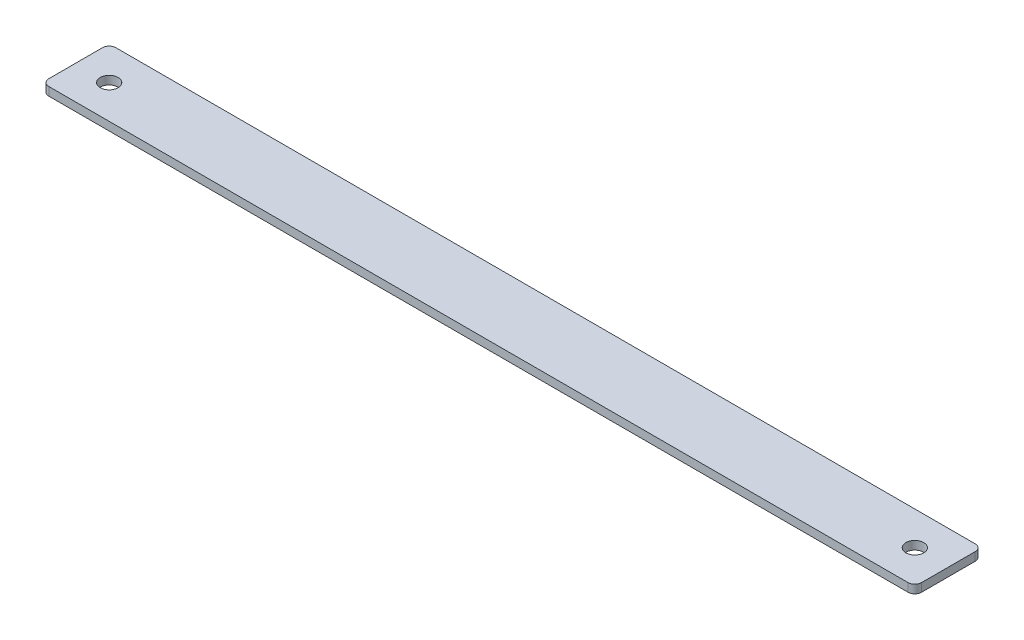
ISO-10303-21;
HEADER;
FILE_DESCRIPTION(('STEP AP214'),'2;1');
FILE_NAME('part.step','',(''),(''),'','','');
FILE_SCHEMA(('AUTOMOTIVE_DESIGN { 1 0 10303 214 1 1 1 1 }'));
ENDSEC;
DATA;
#1=APPLICATION_CONTEXT('core data for automotive mechanical design processes');
#2=APPLICATION_PROTOCOL_DEFINITION('international standard','automotive_design',2000,#1);
#3=PRODUCT_CONTEXT('',#1,'mechanical');
#4=PRODUCT('Part','Part','',(#3));
#5=PRODUCT_RELATED_PRODUCT_CATEGORY('part','',(#4));
#6=PRODUCT_DEFINITION_FORMATION('','',#4);
#7=PRODUCT_DEFINITION_CONTEXT('part definition',#1,'design');
#8=PRODUCT_DEFINITION('design','',#6,#7);
#9=PRODUCT_DEFINITION_SHAPE('','',#8);
#10=(LENGTH_UNIT() NAMED_UNIT(*) SI_UNIT(.MILLI.,.METRE.));
#11=(NAMED_UNIT(*) PLANE_ANGLE_UNIT() SI_UNIT($,.RADIAN.));
#12=(NAMED_UNIT(*) SI_UNIT($,.STERADIAN.) SOLID_ANGLE_UNIT());
#13=UNCERTAINTY_MEASURE_WITH_UNIT(LENGTH_MEASURE(1.E-05),#10,'distance_accuracy_value','');
#14=(GEOMETRIC_REPRESENTATION_CONTEXT(3) GLOBAL_UNCERTAINTY_ASSIGNED_CONTEXT((#13)) GLOBAL_UNIT_ASSIGNED_CONTEXT((#10,
#11,#12)) REPRESENTATION_CONTEXT('',''));
#15=CARTESIAN_POINT('',(0.,0.,0.));
#16=DIRECTION('',(0.,0.,1.));
#17=DIRECTION('',(1.,0.,0.));
#18=AXIS2_PLACEMENT_3D('',#15,#16,#17);
#19=CARTESIAN_POINT('',(0.,3.175,0.));
#20=DIRECTION('',(0.,-1.,0.));
#21=DIRECTION('',(0.,0.,-1.));
#22=AXIS2_PLACEMENT_3D('',#19,#20,#21);
#23=PLANE('',#22);
#24=DIRECTION('',(-1.,0.,0.));
#25=VECTOR('',#24,1.);
#26=CARTESIAN_POINT('',(-165.1,3.175,-12.7));
#27=LINE('',#26,#25);
#28=CARTESIAN_POINT('',(162.56,3.175,-12.7));
#29=VERTEX_POINT('',#28);
#30=CARTESIAN_POINT('',(-162.56,3.175,-12.7));
#31=VERTEX_POINT('',#30);
#32=EDGE_CURVE('E168',#29,#31,#27,.T.);
#33=ORIENTED_EDGE('',*,*,#32,.T.);
#34=CARTESIAN_POINT('',(-162.56,3.175,-10.16));
#35=DIRECTION('',(0.,-1.,0.));
#36=DIRECTION('',(0.,0.,-1.));
#37=AXIS2_PLACEMENT_3D('',#34,#35,#36);
#38=CIRCLE('',#37,2.54);
#39=CARTESIAN_POINT('',(-165.1,3.175,-10.16));
#40=VERTEX_POINT('',#39);
#41=EDGE_CURVE('E146',#31,#40,#38,.F.);
#42=ORIENTED_EDGE('',*,*,#41,.T.);
#43=DIRECTION('',(0.,0.,1.));
#44=VECTOR('',#43,1.);
#45=CARTESIAN_POINT('',(-165.1,3.175,12.7));
#46=LINE('',#45,#44);
#47=CARTESIAN_POINT('',(-165.1,3.175,10.16));
#48=VERTEX_POINT('',#47);
#49=EDGE_CURVE('E116',#40,#48,#46,.T.);
#50=ORIENTED_EDGE('',*,*,#49,.T.);
#51=CARTESIAN_POINT('',(-162.56,3.175,10.16));
#52=DIRECTION('',(0.,-1.,0.));
#53=DIRECTION('',(0.,0.,-1.));
#54=AXIS2_PLACEMENT_3D('',#51,#52,#53);
#55=CIRCLE('',#54,2.54);
#56=CARTESIAN_POINT('',(-162.56,3.175,12.7));
#57=VERTEX_POINT('',#56);
#58=EDGE_CURVE('E52',#48,#57,#55,.F.);
#59=ORIENTED_EDGE('',*,*,#58,.T.);
#60=DIRECTION('',(1.,0.,0.));
#61=VECTOR('',#60,1.);
#62=CARTESIAN_POINT('',(-165.1,3.175,12.7));
#63=LINE('',#62,#61);
#64=CARTESIAN_POINT('',(162.56,3.175,12.7));
#65=VERTEX_POINT('',#64);
#66=EDGE_CURVE('E132',#57,#65,#63,.T.);
#67=ORIENTED_EDGE('',*,*,#66,.T.);
#68=CARTESIAN_POINT('',(162.56,3.175,10.16));
#69=DIRECTION('',(0.,-1.,0.));
#70=DIRECTION('',(0.,0.,-1.));
#71=AXIS2_PLACEMENT_3D('',#68,#69,#70);
#72=CIRCLE('',#71,2.54);
#73=CARTESIAN_POINT('',(165.1,3.175,10.16));
#74=VERTEX_POINT('',#73);
#75=EDGE_CURVE('E142',#65,#74,#72,.F.);
#76=ORIENTED_EDGE('',*,*,#75,.T.);
#77=DIRECTION('',(0.,0.,-1.));
#78=VECTOR('',#77,1.);
#79=CARTESIAN_POINT('',(165.1,3.175,12.7));
#80=LINE('',#79,#78);
#81=CARTESIAN_POINT('',(165.1,3.175,-10.16));
#82=VERTEX_POINT('',#81);
#83=EDGE_CURVE('E126',#74,#82,#80,.T.);
#84=ORIENTED_EDGE('',*,*,#83,.T.);
#85=CARTESIAN_POINT('',(162.56,3.175,-10.16));
#86=DIRECTION('',(0.,-1.,0.));
#87=DIRECTION('',(0.,0.,-1.));
#88=AXIS2_PLACEMENT_3D('',#85,#86,#87);
#89=CIRCLE('',#88,2.54);
#90=EDGE_CURVE('E144',#82,#29,#89,.F.);
#91=ORIENTED_EDGE('',*,*,#90,.T.);
#92=EDGE_LOOP('',(#33,#42,#50,#59,#67,#76,#84,#91));
#93=FACE_BOUND('',#92,.T.);
#94=CARTESIAN_POINT('',(-152.4,3.175,0.));
#95=DIRECTION('',(0.,1.,0.));
#96=DIRECTION('',(0.,0.,1.));
#97=AXIS2_PLACEMENT_3D('',#94,#95,#96);
#98=CIRCLE('',#97,3.3734375);
#99=CARTESIAN_POINT('',(-152.4,3.175,3.3734375));
#100=VERTEX_POINT('',#99);
#101=EDGE_CURVE('E177',#100,#100,#98,.T.);
#102=ORIENTED_EDGE('',*,*,#101,.F.);
#103=EDGE_LOOP('',(#102));
#104=FACE_BOUND('',#103,.T.);
#105=CARTESIAN_POINT('',(152.4,3.175,0.));
#106=DIRECTION('',(0.,1.,0.));
#107=DIRECTION('',(0.,0.,1.));
#108=AXIS2_PLACEMENT_3D('',#105,#106,#107);
#109=CIRCLE('',#108,3.3734375);
#110=CARTESIAN_POINT('',(152.4,3.175,3.3734375));
#111=VERTEX_POINT('',#110);
#112=EDGE_CURVE('E182',#111,#111,#109,.T.);
#113=ORIENTED_EDGE('',*,*,#112,.F.);
#114=EDGE_LOOP('',(#113));
#115=FACE_BOUND('',#114,.T.);
#116=ADVANCED_FACE('F32',(#93,#104,#115),#23,.F.);
#117=CARTESIAN_POINT('',(0.,0.,0.));
#118=DIRECTION('',(0.,-1.,0.));
#119=DIRECTION('',(0.,0.,-1.));
#120=AXIS2_PLACEMENT_3D('',#117,#118,#119);
#121=PLANE('',#120);
#122=CARTESIAN_POINT('',(-152.4,0.,0.));
#123=DIRECTION('',(0.,1.,0.));
#124=DIRECTION('',(0.,0.,1.));
#125=AXIS2_PLACEMENT_3D('',#122,#123,#124);
#126=CIRCLE('',#125,3.3734375);
#127=CARTESIAN_POINT('',(-152.4,0.,3.3734375));
#128=VERTEX_POINT('',#127);
#129=EDGE_CURVE('E173',#128,#128,#126,.T.);
#130=ORIENTED_EDGE('',*,*,#129,.T.);
#131=EDGE_LOOP('',(#130));
#132=FACE_BOUND('',#131,.T.);
#133=DIRECTION('',(0.,0.,1.));
#134=VECTOR('',#133,1.);
#135=CARTESIAN_POINT('',(-165.1,0.,12.7));
#136=LINE('',#135,#134);
#137=CARTESIAN_POINT('',(-165.1,0.,-10.16));
#138=VERTEX_POINT('',#137);
#139=CARTESIAN_POINT('',(-165.1,0.,10.16));
#140=VERTEX_POINT('',#139);
#141=EDGE_CURVE('E114',#138,#140,#136,.T.);
#142=ORIENTED_EDGE('',*,*,#141,.F.);
#143=CARTESIAN_POINT('',(-162.56,0.,-10.16));
#144=DIRECTION('',(0.,-1.,0.));
#145=DIRECTION('',(0.,0.,-1.));
#146=AXIS2_PLACEMENT_3D('',#143,#144,#145);
#147=CIRCLE('',#146,2.54);
#148=CARTESIAN_POINT('',(-162.56,0.,-12.7));
#149=VERTEX_POINT('',#148);
#150=EDGE_CURVE('E97',#138,#149,#147,.T.);
#151=ORIENTED_EDGE('',*,*,#150,.T.);
#152=DIRECTION('',(-1.,0.,0.));
#153=VECTOR('',#152,1.);
#154=CARTESIAN_POINT('',(-165.1,0.,-12.7));
#155=LINE('',#154,#153);
#156=CARTESIAN_POINT('',(162.56,0.,-12.7));
#157=VERTEX_POINT('',#156);
#158=EDGE_CURVE('E124',#157,#149,#155,.T.);
#159=ORIENTED_EDGE('',*,*,#158,.F.);
#160=CARTESIAN_POINT('',(162.56,0.,-10.16));
#161=DIRECTION('',(0.,-1.,0.));
#162=DIRECTION('',(0.,0.,-1.));
#163=AXIS2_PLACEMENT_3D('',#160,#161,#162);
#164=CIRCLE('',#163,2.54);
#165=CARTESIAN_POINT('',(165.1,0.,-10.16));
#166=VERTEX_POINT('',#165);
#167=EDGE_CURVE('E108',#157,#166,#164,.T.);
#168=ORIENTED_EDGE('',*,*,#167,.T.);
#169=DIRECTION('',(0.,0.,-1.));
#170=VECTOR('',#169,1.);
#171=CARTESIAN_POINT('',(165.1,0.,12.7));
#172=LINE('',#171,#170);
#173=CARTESIAN_POINT('',(165.1,0.,10.16));
#174=VERTEX_POINT('',#173);
#175=EDGE_CURVE('E128',#174,#166,#172,.T.);
#176=ORIENTED_EDGE('',*,*,#175,.F.);
#177=CARTESIAN_POINT('',(162.56,0.,10.16));
#178=DIRECTION('',(0.,-1.,0.));
#179=DIRECTION('',(0.,0.,-1.));
#180=AXIS2_PLACEMENT_3D('',#177,#178,#179);
#181=CIRCLE('',#180,2.54);
#182=CARTESIAN_POINT('',(162.56,0.,12.7));
#183=VERTEX_POINT('',#182);
#184=EDGE_CURVE('E135',#174,#183,#181,.T.);
#185=ORIENTED_EDGE('',*,*,#184,.T.);
#186=DIRECTION('',(1.,0.,0.));
#187=VECTOR('',#186,1.);
#188=CARTESIAN_POINT('',(-165.1,0.,12.7));
#189=LINE('',#188,#187);
#190=CARTESIAN_POINT('',(-162.56,0.,12.7));
#191=VERTEX_POINT('',#190);
#192=EDGE_CURVE('E123',#191,#183,#189,.T.);
#193=ORIENTED_EDGE('',*,*,#192,.F.);
#194=CARTESIAN_POINT('',(-162.56,0.,10.16));
#195=DIRECTION('',(0.,-1.,0.));
#196=DIRECTION('',(0.,0.,-1.));
#197=AXIS2_PLACEMENT_3D('',#194,#195,#196);
#198=CIRCLE('',#197,2.54);
#199=EDGE_CURVE('E117',#191,#140,#198,.T.);
#200=ORIENTED_EDGE('',*,*,#199,.T.);
#201=EDGE_LOOP('',(#142,#151,#159,#168,#176,#185,#193,#200));
#202=FACE_BOUND('',#201,.T.);
#203=CARTESIAN_POINT('',(152.4,0.,0.));
#204=DIRECTION('',(0.,1.,0.));
#205=DIRECTION('',(0.,0.,1.));
#206=AXIS2_PLACEMENT_3D('',#203,#204,#205);
#207=CIRCLE('',#206,3.3734375);
#208=CARTESIAN_POINT('',(152.4,0.,3.3734375));
#209=VERTEX_POINT('',#208);
#210=EDGE_CURVE('E184',#209,#209,#207,.T.);
#211=ORIENTED_EDGE('',*,*,#210,.T.);
#212=EDGE_LOOP('',(#211));
#213=FACE_BOUND('',#212,.T.);
#214=ADVANCED_FACE('F120',(#132,#202,#213),#121,.T.);
#215=CARTESIAN_POINT('',(165.1,3.175,12.7));
#216=DIRECTION('',(-1.,0.,0.));
#217=DIRECTION('',(0.,0.,1.));
#218=AXIS2_PLACEMENT_3D('',#215,#216,#217);
#219=PLANE('',#218);
#220=ORIENTED_EDGE('',*,*,#175,.T.);
#221=DIRECTION('',(0.,-1.,0.));
#222=VECTOR('',#221,1.);
#223=CARTESIAN_POINT('',(165.1,3.175,-10.16));
#224=LINE('',#223,#222);
#225=EDGE_CURVE('E151',#166,#82,#224,.F.);
#226=ORIENTED_EDGE('',*,*,#225,.T.);
#227=ORIENTED_EDGE('',*,*,#83,.F.);
#228=DIRECTION('',(0.,-1.,0.));
#229=VECTOR('',#228,1.);
#230=CARTESIAN_POINT('',(165.1,3.175,10.16));
#231=LINE('',#230,#229);
#232=EDGE_CURVE('E148',#74,#174,#231,.T.);
#233=ORIENTED_EDGE('',*,*,#232,.T.);
#234=EDGE_LOOP('',(#220,#226,#227,#233));
#235=FACE_BOUND('',#234,.T.);
#236=ADVANCED_FACE('F164',(#235),#219,.F.);
#237=CARTESIAN_POINT('',(-165.1,3.175,-12.7));
#238=DIRECTION('',(0.,0.,1.));
#239=DIRECTION('',(1.,0.,0.));
#240=AXIS2_PLACEMENT_3D('',#237,#238,#239);
#241=PLANE('',#240);
#242=ORIENTED_EDGE('',*,*,#158,.T.);
#243=DIRECTION('',(0.,-1.,0.));
#244=VECTOR('',#243,1.);
#245=CARTESIAN_POINT('',(-162.56,3.175,-12.7));
#246=LINE('',#245,#244);
#247=EDGE_CURVE('E102',#149,#31,#246,.F.);
#248=ORIENTED_EDGE('',*,*,#247,.T.);
#249=ORIENTED_EDGE('',*,*,#32,.F.);
#250=DIRECTION('',(0.,-1.,0.));
#251=VECTOR('',#250,1.);
#252=CARTESIAN_POINT('',(162.56,3.175,-12.7));
#253=LINE('',#252,#251);
#254=EDGE_CURVE('E107',#29,#157,#253,.T.);
#255=ORIENTED_EDGE('',*,*,#254,.T.);
#256=EDGE_LOOP('',(#242,#248,#249,#255));
#257=FACE_BOUND('',#256,.T.);
#258=ADVANCED_FACE('F209',(#257),#241,.F.);
#259=CARTESIAN_POINT('',(-165.1,3.175,12.7));
#260=DIRECTION('',(1.,0.,0.));
#261=DIRECTION('',(0.,0.,-1.));
#262=AXIS2_PLACEMENT_3D('',#259,#260,#261);
#263=PLANE('',#262);
#264=ORIENTED_EDGE('',*,*,#49,.F.);
#265=DIRECTION('',(0.,-1.,0.));
#266=VECTOR('',#265,1.);
#267=CARTESIAN_POINT('',(-165.1,3.175,-10.16));
#268=LINE('',#267,#266);
#269=EDGE_CURVE('E101',#40,#138,#268,.T.);
#270=ORIENTED_EDGE('',*,*,#269,.T.);
#271=ORIENTED_EDGE('',*,*,#141,.T.);
#272=DIRECTION('',(0.,-1.,0.));
#273=VECTOR('',#272,1.);
#274=CARTESIAN_POINT('',(-165.1,3.175,10.16));
#275=LINE('',#274,#273);
#276=EDGE_CURVE('E118',#140,#48,#275,.F.);
#277=ORIENTED_EDGE('',*,*,#276,.T.);
#278=EDGE_LOOP('',(#264,#270,#271,#277));
#279=FACE_BOUND('',#278,.T.);
#280=ADVANCED_FACE('F113',(#279),#263,.F.);
#281=CARTESIAN_POINT('',(-165.1,3.175,12.7));
#282=DIRECTION('',(0.,0.,-1.));
#283=DIRECTION('',(-1.,0.,0.));
#284=AXIS2_PLACEMENT_3D('',#281,#282,#283);
#285=PLANE('',#284);
#286=ORIENTED_EDGE('',*,*,#192,.T.);
#287=DIRECTION('',(0.,-1.,0.));
#288=VECTOR('',#287,1.);
#289=CARTESIAN_POINT('',(162.56,3.175,12.7));
#290=LINE('',#289,#288);
#291=EDGE_CURVE('E11',#183,#65,#290,.F.);
#292=ORIENTED_EDGE('',*,*,#291,.T.);
#293=ORIENTED_EDGE('',*,*,#66,.F.);
#294=DIRECTION('',(0.,-1.,0.));
#295=VECTOR('',#294,1.);
#296=CARTESIAN_POINT('',(-162.56,3.175,12.7));
#297=LINE('',#296,#295);
#298=EDGE_CURVE('E40',#57,#191,#297,.T.);
#299=ORIENTED_EDGE('',*,*,#298,.T.);
#300=EDGE_LOOP('',(#286,#292,#293,#299));
#301=FACE_BOUND('',#300,.T.);
#302=ADVANCED_FACE('F154',(#301),#285,.F.);
#303=CARTESIAN_POINT('',(-152.4,3.175,0.));
#304=DIRECTION('',(0.,-1.,0.));
#305=DIRECTION('',(0.,0.,-1.));
#306=AXIS2_PLACEMENT_3D('',#303,#304,#305);
#307=CYLINDRICAL_SURFACE('',#306,3.3734375);
#308=ORIENTED_EDGE('',*,*,#101,.T.);
#309=EDGE_LOOP('',(#308));
#310=FACE_BOUND('',#309,.T.);
#311=ORIENTED_EDGE('',*,*,#129,.F.);
#312=EDGE_LOOP('',(#311));
#313=FACE_BOUND('',#312,.T.);
#314=ADVANCED_FACE('F202',(#310,#313),#307,.F.);
#315=CARTESIAN_POINT('',(152.4,3.175,0.));
#316=DIRECTION('',(0.,-1.,0.));
#317=DIRECTION('',(0.,0.,-1.));
#318=AXIS2_PLACEMENT_3D('',#315,#316,#317);
#319=CYLINDRICAL_SURFACE('',#318,3.3734375);
#320=ORIENTED_EDGE('',*,*,#112,.T.);
#321=EDGE_LOOP('',(#320));
#322=FACE_BOUND('',#321,.T.);
#323=ORIENTED_EDGE('',*,*,#210,.F.);
#324=EDGE_LOOP('',(#323));
#325=FACE_BOUND('',#324,.T.);
#326=ADVANCED_FACE('F190',(#322,#325),#319,.F.);
#327=CARTESIAN_POINT('',(-162.56,3.175,-10.16));
#328=DIRECTION('',(0.,-1.,0.));
#329=DIRECTION('',(0.,0.,-1.));
#330=AXIS2_PLACEMENT_3D('',#327,#328,#329);
#331=CYLINDRICAL_SURFACE('',#330,2.54);
#332=ORIENTED_EDGE('',*,*,#41,.F.);
#333=ORIENTED_EDGE('',*,*,#247,.F.);
#334=ORIENTED_EDGE('',*,*,#150,.F.);
#335=ORIENTED_EDGE('',*,*,#269,.F.);
#336=EDGE_LOOP('',(#332,#333,#334,#335));
#337=FACE_BOUND('',#336,.T.);
#338=ADVANCED_FACE('F100',(#337),#331,.T.);
#339=CARTESIAN_POINT('',(162.56,3.175,-10.16));
#340=DIRECTION('',(0.,-1.,0.));
#341=DIRECTION('',(0.,0.,-1.));
#342=AXIS2_PLACEMENT_3D('',#339,#340,#341);
#343=CYLINDRICAL_SURFACE('',#342,2.54);
#344=ORIENTED_EDGE('',*,*,#90,.F.);
#345=ORIENTED_EDGE('',*,*,#225,.F.);
#346=ORIENTED_EDGE('',*,*,#167,.F.);
#347=ORIENTED_EDGE('',*,*,#254,.F.);
#348=EDGE_LOOP('',(#344,#345,#346,#347));
#349=FACE_BOUND('',#348,.T.);
#350=ADVANCED_FACE('F217',(#349),#343,.T.);
#351=CARTESIAN_POINT('',(162.56,3.175,10.16));
#352=DIRECTION('',(0.,-1.,0.));
#353=DIRECTION('',(0.,0.,-1.));
#354=AXIS2_PLACEMENT_3D('',#351,#352,#353);
#355=CYLINDRICAL_SURFACE('',#354,2.54);
#356=ORIENTED_EDGE('',*,*,#75,.F.);
#357=ORIENTED_EDGE('',*,*,#291,.F.);
#358=ORIENTED_EDGE('',*,*,#184,.F.);
#359=ORIENTED_EDGE('',*,*,#232,.F.);
#360=EDGE_LOOP('',(#356,#357,#358,#359));
#361=FACE_BOUND('',#360,.T.);
#362=ADVANCED_FACE('F161',(#361),#355,.T.);
#363=CARTESIAN_POINT('',(-162.56,3.175,10.16));
#364=DIRECTION('',(0.,-1.,0.));
#365=DIRECTION('',(0.,0.,-1.));
#366=AXIS2_PLACEMENT_3D('',#363,#364,#365);
#367=CYLINDRICAL_SURFACE('',#366,2.54);
#368=ORIENTED_EDGE('',*,*,#58,.F.);
#369=ORIENTED_EDGE('',*,*,#276,.F.);
#370=ORIENTED_EDGE('',*,*,#199,.F.);
#371=ORIENTED_EDGE('',*,*,#298,.F.);
#372=EDGE_LOOP('',(#368,#369,#370,#371));
#373=FACE_BOUND('',#372,.T.);
#374=ADVANCED_FACE('F34',(#373),#367,.T.);
#375=CLOSED_SHELL('',(#116,#214,#236,#258,#280,#302,#314,#326,#338,#350,#362,#374));
#376=MANIFOLD_SOLID_BREP('B2',#375);
#377=ADVANCED_BREP_SHAPE_REPRESENTATION('',(#18,#376),#14);
#378=SHAPE_DEFINITION_REPRESENTATION(#9,#377);
ENDSEC;
END-ISO-10303-21;
